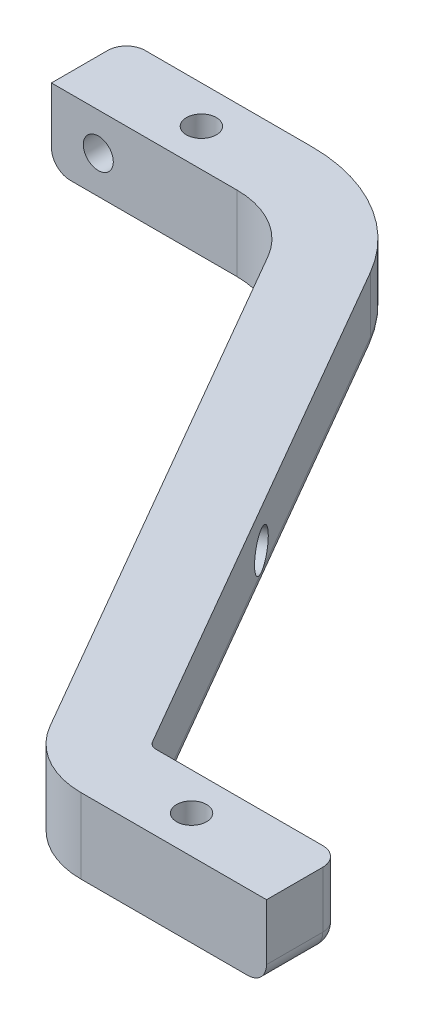
ISO-10303-21;
HEADER;
FILE_DESCRIPTION(('STEP AP214'),'2;1');
FILE_NAME('part.step','',(''),(''),'','','');
FILE_SCHEMA(('AUTOMOTIVE_DESIGN { 1 0 10303 214 1 1 1 1 }'));
ENDSEC;
DATA;
#1=APPLICATION_CONTEXT('core data for automotive mechanical design processes');
#2=APPLICATION_PROTOCOL_DEFINITION('international standard','automotive_design',2000,#1);
#3=PRODUCT_CONTEXT('',#1,'mechanical');
#4=PRODUCT('Part','Part','',(#3));
#5=PRODUCT_RELATED_PRODUCT_CATEGORY('part','',(#4));
#6=PRODUCT_DEFINITION_FORMATION('','',#4);
#7=PRODUCT_DEFINITION_CONTEXT('part definition',#1,'design');
#8=PRODUCT_DEFINITION('design','',#6,#7);
#9=PRODUCT_DEFINITION_SHAPE('','',#8);
#10=(LENGTH_UNIT() NAMED_UNIT(*) SI_UNIT(.MILLI.,.METRE.));
#11=(NAMED_UNIT(*) PLANE_ANGLE_UNIT() SI_UNIT($,.RADIAN.));
#12=(NAMED_UNIT(*) SI_UNIT($,.STERADIAN.) SOLID_ANGLE_UNIT());
#13=UNCERTAINTY_MEASURE_WITH_UNIT(LENGTH_MEASURE(1.E-05),#10,'distance_accuracy_value','');
#14=(GEOMETRIC_REPRESENTATION_CONTEXT(3) GLOBAL_UNCERTAINTY_ASSIGNED_CONTEXT((#13)) GLOBAL_UNIT_ASSIGNED_CONTEXT((#10,
#11,#12)) REPRESENTATION_CONTEXT('',''));
#15=CARTESIAN_POINT('',(0.,0.,0.));
#16=DIRECTION('',(0.,0.,1.));
#17=DIRECTION('',(1.,0.,0.));
#18=AXIS2_PLACEMENT_3D('',#15,#16,#17);
#19=CARTESIAN_POINT('',(93.4021231503077,4.,3.17468245269469));
#20=DIRECTION('',(-0.86602540378444,0.,0.499999999999998));
#21=DIRECTION('',(0.499999999999998,0.,0.86602540378444));
#22=AXIS2_PLACEMENT_3D('',#19,#20,#21);
#23=CYLINDRICAL_SURFACE('',#22,1.6);
#24=CARTESIAN_POINT('',(43.4752086140679,4.,32.));
#25=DIRECTION('',(-0.86602540378444,0.,0.499999999999998));
#26=DIRECTION('',(0.499999999999998,0.,0.86602540378444));
#27=AXIS2_PLACEMENT_3D('',#24,#25,#26);
#28=CIRCLE('',#27,1.6);
#29=CARTESIAN_POINT('',(44.2752086140679,4.,33.3856406460551));
#30=VERTEX_POINT('',#29);
#31=EDGE_CURVE('E220',#30,#30,#28,.T.);
#32=ORIENTED_EDGE('',*,*,#31,.T.);
#33=EDGE_LOOP('',(#32));
#34=FACE_BOUND('',#33,.T.);
#35=CARTESIAN_POINT('',(45.640272123529,4.,30.75));
#36=DIRECTION('',(0.86602540378444,0.,-0.499999999999998));
#37=DIRECTION('',(-0.499999999999998,0.,-0.86602540378444));
#38=AXIS2_PLACEMENT_3D('',#35,#36,#37);
#39=CIRCLE('',#38,1.6);
#40=CARTESIAN_POINT('',(44.840272123529,4.,29.3643593539449));
#41=VERTEX_POINT('',#40);
#42=EDGE_CURVE('E218',#41,#41,#39,.F.);
#43=ORIENTED_EDGE('',*,*,#42,.F.);
#44=EDGE_LOOP('',(#43));
#45=FACE_BOUND('',#44,.T.);
#46=ADVANCED_FACE('F32',(#34,#45),#23,.F.);
#47=CARTESIAN_POINT('',(12.,0.,-4.));
#48=DIRECTION('',(0.,1.,0.));
#49=DIRECTION('',(0.,0.,1.));
#50=AXIS2_PLACEMENT_3D('',#47,#48,#49);
#51=CYLINDRICAL_SURFACE('',#50,1.6);
#52=CARTESIAN_POINT('',(12.,8.,-4.));
#53=DIRECTION('',(0.,1.,0.));
#54=DIRECTION('',(0.,0.,1.));
#55=AXIS2_PLACEMENT_3D('',#52,#53,#54);
#56=CIRCLE('',#55,1.6);
#57=CARTESIAN_POINT('',(12.,8.,-2.4));
#58=VERTEX_POINT('',#57);
#59=EDGE_CURVE('E212',#58,#58,#56,.T.);
#60=ORIENTED_EDGE('',*,*,#59,.T.);
#61=EDGE_LOOP('',(#60));
#62=FACE_BOUND('',#61,.T.);
#63=CARTESIAN_POINT('',(12.,5.5,-4.));
#64=DIRECTION('',(0.,-1.,0.));
#65=DIRECTION('',(0.,0.,-1.));
#66=AXIS2_PLACEMENT_3D('',#63,#64,#65);
#67=CIRCLE('',#66,1.6);
#68=CARTESIAN_POINT('',(12.,5.5,-5.6));
#69=VERTEX_POINT('',#68);
#70=EDGE_CURVE('E208',#69,#69,#67,.F.);
#71=ORIENTED_EDGE('',*,*,#70,.F.);
#72=EDGE_LOOP('',(#71));
#73=FACE_BOUND('',#72,.T.);
#74=ADVANCED_FACE('F431',(#62,#73),#51,.F.);
#75=CARTESIAN_POINT('',(74.9504172281358,0.,60.));
#76=DIRECTION('',(0.,1.,0.));
#77=DIRECTION('',(0.,0.,1.));
#78=AXIS2_PLACEMENT_3D('',#75,#76,#77);
#79=CYLINDRICAL_SURFACE('',#78,1.60000000000001);
#80=CARTESIAN_POINT('',(74.9504172281358,8.,60.));
#81=DIRECTION('',(0.,1.,0.));
#82=DIRECTION('',(0.,0.,1.));
#83=AXIS2_PLACEMENT_3D('',#80,#81,#82);
#84=CIRCLE('',#83,1.60000000000001);
#85=CARTESIAN_POINT('',(74.9504172281358,8.,61.6));
#86=VERTEX_POINT('',#85);
#87=EDGE_CURVE('E323',#86,#86,#84,.T.);
#88=ORIENTED_EDGE('',*,*,#87,.T.);
#89=EDGE_LOOP('',(#88));
#90=FACE_BOUND('',#89,.T.);
#91=CARTESIAN_POINT('',(74.9504172281358,5.5,60.));
#92=DIRECTION('',(0.,-1.,0.));
#93=DIRECTION('',(0.,0.,-1.));
#94=AXIS2_PLACEMENT_3D('',#91,#92,#93);
#95=CIRCLE('',#94,1.60000000000001);
#96=CARTESIAN_POINT('',(74.9504172281358,5.5,58.4));
#97=VERTEX_POINT('',#96);
#98=EDGE_CURVE('E205',#97,#97,#95,.F.);
#99=ORIENTED_EDGE('',*,*,#98,.F.);
#100=EDGE_LOOP('',(#99));
#101=FACE_BOUND('',#100,.T.);
#102=ADVANCED_FACE('F439',(#90,#101),#79,.F.);
#103=CARTESIAN_POINT('',(67.1465696508425,8.,64.));
#104=DIRECTION('',(0.,0.,-1.));
#105=DIRECTION('',(-1.,0.,0.));
#106=AXIS2_PLACEMENT_3D('',#103,#104,#105);
#107=PLANE('',#106);
#108=DIRECTION('',(1.,0.,0.));
#109=VECTOR('',#108,1.);
#110=CARTESIAN_POINT('',(67.1465696508425,0.,64.));
#111=LINE('',#110,#109);
#112=CARTESIAN_POINT('',(67.1465696508425,0.,64.));
#113=VERTEX_POINT('',#112);
#114=CARTESIAN_POINT('',(84.9504172281358,0.,64.));
#115=VERTEX_POINT('',#114);
#116=EDGE_CURVE('E326',#113,#115,#111,.T.);
#117=ORIENTED_EDGE('',*,*,#116,.T.);
#118=CARTESIAN_POINT('',(84.9504172281358,2.,64.));
#119=DIRECTION('',(0.,0.,-1.));
#120=DIRECTION('',(-1.,0.,0.));
#121=AXIS2_PLACEMENT_3D('',#118,#119,#120);
#122=CIRCLE('',#121,2.);
#123=CARTESIAN_POINT('',(86.9504172281358,2.,64.));
#124=VERTEX_POINT('',#123);
#125=EDGE_CURVE('E194',#115,#124,#122,.F.);
#126=ORIENTED_EDGE('',*,*,#125,.T.);
#127=DIRECTION('',(0.,-1.,0.));
#128=VECTOR('',#127,1.);
#129=CARTESIAN_POINT('',(86.9504172281358,8.,64.));
#130=LINE('',#129,#128);
#131=CARTESIAN_POINT('',(86.9504172281358,8.,64.));
#132=VERTEX_POINT('',#131);
#133=EDGE_CURVE('E174',#132,#124,#130,.T.);
#134=ORIENTED_EDGE('',*,*,#133,.F.);
#135=DIRECTION('',(1.,0.,0.));
#136=VECTOR('',#135,1.);
#137=CARTESIAN_POINT('',(67.1465696508425,8.,64.));
#138=LINE('',#137,#136);
#139=CARTESIAN_POINT('',(67.1465696508425,8.,64.));
#140=VERTEX_POINT('',#139);
#141=EDGE_CURVE('E179',#140,#132,#138,.T.);
#142=ORIENTED_EDGE('',*,*,#141,.F.);
#143=DIRECTION('',(0.,-1.,0.));
#144=VECTOR('',#143,1.);
#145=CARTESIAN_POINT('',(67.1465696508425,8.,64.));
#146=LINE('',#145,#144);
#147=EDGE_CURVE('E352',#140,#113,#146,.T.);
#148=ORIENTED_EDGE('',*,*,#147,.T.);
#149=EDGE_LOOP('',(#117,#126,#134,#142,#148));
#150=FACE_BOUND('',#149,.T.);
#151=ADVANCED_FACE('F192',(#150),#107,.F.);
#152=CARTESIAN_POINT('',(86.9504172281358,8.,56.));
#153=DIRECTION('',(1.,0.,0.));
#154=DIRECTION('',(0.,0.,-1.));
#155=AXIS2_PLACEMENT_3D('',#152,#153,#154);
#156=PLANE('',#155);
#157=ORIENTED_EDGE('',*,*,#133,.T.);
#158=DIRECTION('',(0.,0.,1.));
#159=VECTOR('',#158,1.);
#160=CARTESIAN_POINT('',(86.9504172281358,2.,56.));
#161=LINE('',#160,#159);
#162=CARTESIAN_POINT('',(86.9504172281358,2.,58.));
#163=VERTEX_POINT('',#162);
#164=EDGE_CURVE('E55',#124,#163,#161,.F.);
#165=ORIENTED_EDGE('',*,*,#164,.T.);
#166=DIRECTION('',(0.,-1.,0.));
#167=VECTOR('',#166,1.);
#168=CARTESIAN_POINT('',(86.9504172281358,8.,58.));
#169=LINE('',#168,#167);
#170=CARTESIAN_POINT('',(86.9504172281358,8.,58.));
#171=VERTEX_POINT('',#170);
#172=EDGE_CURVE('E175',#163,#171,#169,.F.);
#173=ORIENTED_EDGE('',*,*,#172,.T.);
#174=DIRECTION('',(0.,0.,1.));
#175=VECTOR('',#174,1.);
#176=CARTESIAN_POINT('',(86.9504172281358,8.,56.));
#177=LINE('',#176,#175);
#178=EDGE_CURVE('E170',#171,#132,#177,.T.);
#179=ORIENTED_EDGE('',*,*,#178,.T.);
#180=EDGE_LOOP('',(#157,#165,#173,#179));
#181=FACE_BOUND('',#180,.T.);
#182=ADVANCED_FACE('F172',(#181),#156,.T.);
#183=CARTESIAN_POINT('',(67.1465696508425,8.,56.));
#184=DIRECTION('',(0.,0.,-1.));
#185=DIRECTION('',(-1.,0.,0.));
#186=AXIS2_PLACEMENT_3D('',#183,#184,#185);
#187=PLANE('',#186);
#188=DIRECTION('',(0.,-1.,0.));
#189=VECTOR('',#188,1.);
#190=CARTESIAN_POINT('',(84.9504172281358,8.,56.));
#191=LINE('',#190,#189);
#192=CARTESIAN_POINT('',(84.9504172281358,8.,56.));
#193=VERTEX_POINT('',#192);
#194=CARTESIAN_POINT('',(84.9504172281358,2.,56.));
#195=VERTEX_POINT('',#194);
#196=EDGE_CURVE('E247',#193,#195,#191,.T.);
#197=ORIENTED_EDGE('',*,*,#196,.T.);
#198=DIRECTION('',(1.,0.,0.));
#199=VECTOR('',#198,1.);
#200=CARTESIAN_POINT('',(67.1465696508425,2.,56.));
#201=LINE('',#200,#199);
#202=CARTESIAN_POINT('',(67.1465696508425,2.,56.));
#203=VERTEX_POINT('',#202);
#204=EDGE_CURVE('E249',#195,#203,#201,.F.);
#205=ORIENTED_EDGE('',*,*,#204,.T.);
#206=DIRECTION('',(0.,-1.,0.));
#207=VECTOR('',#206,1.);
#208=CARTESIAN_POINT('',(67.1465696508425,8.,56.));
#209=LINE('',#208,#207);
#210=CARTESIAN_POINT('',(67.1465696508425,8.,56.));
#211=VERTEX_POINT('',#210);
#212=EDGE_CURVE('E196',#211,#203,#209,.T.);
#213=ORIENTED_EDGE('',*,*,#212,.F.);
#214=DIRECTION('',(1.,0.,0.));
#215=VECTOR('',#214,1.);
#216=CARTESIAN_POINT('',(67.1465696508425,8.,56.));
#217=LINE('',#216,#215);
#218=EDGE_CURVE('E178',#211,#193,#217,.T.);
#219=ORIENTED_EDGE('',*,*,#218,.T.);
#220=EDGE_LOOP('',(#197,#205,#213,#219));
#221=FACE_BOUND('',#220,.T.);
#222=ADVANCED_FACE('F540',(#221),#187,.T.);
#223=CARTESIAN_POINT('',(67.1465696508425,8.,55.));
#224=DIRECTION('',(0.,-1.,0.));
#225=DIRECTION('',(0.,0.,-1.));
#226=AXIS2_PLACEMENT_3D('',#223,#224,#225);
#227=CYLINDRICAL_SURFACE('',#226,1.00000000000001);
#228=ORIENTED_EDGE('',*,*,#212,.T.);
#229=CARTESIAN_POINT('',(67.1465696508425,2.,55.));
#230=DIRECTION('',(0.,1.,0.));
#231=DIRECTION('',(0.,0.,1.));
#232=AXIS2_PLACEMENT_3D('',#229,#230,#231);
#233=CIRCLE('',#232,1.00000000000001);
#234=CARTESIAN_POINT('',(66.280544247058,2.,55.5));
#235=VERTEX_POINT('',#234);
#236=EDGE_CURVE('E251',#203,#235,#233,.F.);
#237=ORIENTED_EDGE('',*,*,#236,.T.);
#238=DIRECTION('',(0.,-1.,0.));
#239=VECTOR('',#238,1.);
#240=CARTESIAN_POINT('',(66.280544247058,8.,55.5));
#241=LINE('',#240,#239);
#242=CARTESIAN_POINT('',(66.280544247058,8.,55.5));
#243=VERTEX_POINT('',#242);
#244=EDGE_CURVE('E201',#243,#235,#241,.T.);
#245=ORIENTED_EDGE('',*,*,#244,.F.);
#246=CARTESIAN_POINT('',(67.1465696508425,8.,55.));
#247=DIRECTION('',(0.,1.,0.));
#248=DIRECTION('',(1.,0.,0.));
#249=AXIS2_PLACEMENT_3D('',#246,#247,#248);
#250=CIRCLE('',#249,1.00000000000001);
#251=EDGE_CURVE('E331',#243,#211,#250,.T.);
#252=ORIENTED_EDGE('',*,*,#251,.T.);
#253=EDGE_LOOP('',(#228,#237,#245,#252));
#254=FACE_BOUND('',#253,.T.);
#255=ADVANCED_FACE('F400',(#254),#227,.F.);
#256=CARTESIAN_POINT('',(34.5262794416288,8.,0.500000000000033));
#257=DIRECTION('',(0.86602540378444,0.,-0.499999999999998));
#258=DIRECTION('',(-0.499999999999998,0.,-0.86602540378444));
#259=AXIS2_PLACEMENT_3D('',#256,#257,#258);
#260=PLANE('',#259);
#261=ORIENTED_EDGE('',*,*,#244,.T.);
#262=DIRECTION('',(0.499999999999998,0.,0.86602540378444));
#263=VECTOR('',#262,1.);
#264=CARTESIAN_POINT('',(34.5262794416288,2.,0.50000000000003));
#265=LINE('',#264,#263);
#266=CARTESIAN_POINT('',(50.4034118443435,2.,28.));
#267=VERTEX_POINT('',#266);
#268=EDGE_CURVE('E11',#235,#267,#265,.F.);
#269=ORIENTED_EDGE('',*,*,#268,.T.);
#270=CARTESIAN_POINT('',(50.4034118443435,4.,28.));
#271=DIRECTION('',(0.86602540378444,0.,-0.499999999999998));
#272=DIRECTION('',(-0.499999999999998,0.,-0.86602540378444));
#273=AXIS2_PLACEMENT_3D('',#270,#271,#272);
#274=CIRCLE('',#273,2.);
#275=EDGE_CURVE('E296',#267,#267,#274,.T.);
#276=ORIENTED_EDGE('',*,*,#275,.F.);
#277=DIRECTION('',(0.499999999999998,0.,0.86602540378444));
#278=VECTOR('',#277,1.);
#279=CARTESIAN_POINT('',(34.5262794416288,2.,0.50000000000003));
#280=LINE('',#279,#278);
#281=CARTESIAN_POINT('',(34.5262794416288,2.,0.500000000000035));
#282=VERTEX_POINT('',#281);
#283=EDGE_CURVE('E41',#267,#282,#280,.F.);
#284=ORIENTED_EDGE('',*,*,#283,.T.);
#285=DIRECTION('',(0.,-1.,0.));
#286=VECTOR('',#285,1.);
#287=CARTESIAN_POINT('',(34.5262794416288,8.,0.500000000000035));
#288=LINE('',#287,#286);
#289=CARTESIAN_POINT('',(34.5262794416288,8.,0.500000000000035));
#290=VERTEX_POINT('',#289);
#291=EDGE_CURVE('E377',#290,#282,#288,.T.);
#292=ORIENTED_EDGE('',*,*,#291,.F.);
#293=DIRECTION('',(0.499999999999998,0.,0.86602540378444));
#294=VECTOR('',#293,1.);
#295=CARTESIAN_POINT('',(34.5262794416288,8.,0.500000000000033));
#296=LINE('',#295,#294);
#297=EDGE_CURVE('E334',#290,#243,#296,.T.);
#298=ORIENTED_EDGE('',*,*,#297,.T.);
#299=EDGE_LOOP('',(#261,#269,#276,#284,#292,#298));
#300=FACE_BOUND('',#299,.T.);
#301=ADVANCED_FACE('F380',(#300),#260,.T.);
#302=CARTESIAN_POINT('',(19.8038475772934,8.,9.));
#303=DIRECTION('',(0.,-1.,0.));
#304=DIRECTION('',(0.,0.,-1.));
#305=AXIS2_PLACEMENT_3D('',#302,#303,#304);
#306=CYLINDRICAL_SURFACE('',#305,17.);
#307=ORIENTED_EDGE('',*,*,#291,.T.);
#308=CARTESIAN_POINT('',(19.8038475772934,2.,9.));
#309=DIRECTION('',(0.,1.,0.));
#310=DIRECTION('',(0.,0.,1.));
#311=AXIS2_PLACEMENT_3D('',#308,#309,#310);
#312=CIRCLE('',#311,17.);
#313=CARTESIAN_POINT('',(19.8038475772934,2.,-8.));
#314=VERTEX_POINT('',#313);
#315=EDGE_CURVE('E245',#282,#314,#312,.T.);
#316=ORIENTED_EDGE('',*,*,#315,.T.);
#317=DIRECTION('',(0.,-1.,0.));
#318=VECTOR('',#317,1.);
#319=CARTESIAN_POINT('',(19.8038475772934,8.,-8.));
#320=LINE('',#319,#318);
#321=CARTESIAN_POINT('',(19.8038475772934,8.,-8.));
#322=VERTEX_POINT('',#321);
#323=EDGE_CURVE('E374',#322,#314,#320,.T.);
#324=ORIENTED_EDGE('',*,*,#323,.F.);
#325=CARTESIAN_POINT('',(19.8038475772934,8.,9.));
#326=DIRECTION('',(0.,1.,0.));
#327=DIRECTION('',(1.,0.,0.));
#328=AXIS2_PLACEMENT_3D('',#325,#326,#327);
#329=CIRCLE('',#328,17.);
#330=EDGE_CURVE('E337',#322,#290,#329,.F.);
#331=ORIENTED_EDGE('',*,*,#330,.T.);
#332=EDGE_LOOP('',(#307,#316,#324,#331));
#333=FACE_BOUND('',#332,.T.);
#334=ADVANCED_FACE('F395',(#333),#306,.T.);
#335=CARTESIAN_POINT('',(0.,8.,-8.));
#336=DIRECTION('',(0.,0.,-1.));
#337=DIRECTION('',(-1.,0.,0.));
#338=AXIS2_PLACEMENT_3D('',#335,#336,#337);
#339=PLANE('',#338);
#340=ORIENTED_EDGE('',*,*,#323,.T.);
#341=DIRECTION('',(1.,0.,0.));
#342=VECTOR('',#341,1.);
#343=CARTESIAN_POINT('',(0.,2.,-8.));
#344=LINE('',#343,#342);
#345=CARTESIAN_POINT('',(4.99999999999996,2.,-8.));
#346=VERTEX_POINT('',#345);
#347=EDGE_CURVE('E243',#314,#346,#344,.F.);
#348=ORIENTED_EDGE('',*,*,#347,.T.);
#349=CARTESIAN_POINT('',(4.99999999999996,4.,-8.));
#350=DIRECTION('',(0.,0.,1.));
#351=DIRECTION('',(1.,0.,0.));
#352=AXIS2_PLACEMENT_3D('',#349,#350,#351);
#353=CIRCLE('',#352,2.);
#354=EDGE_CURVE('E305',#346,#346,#353,.T.);
#355=ORIENTED_EDGE('',*,*,#354,.T.);
#356=DIRECTION('',(1.,0.,0.));
#357=VECTOR('',#356,1.);
#358=CARTESIAN_POINT('',(0.,2.,-8.));
#359=LINE('',#358,#357);
#360=CARTESIAN_POINT('',(2.,2.,-8.));
#361=VERTEX_POINT('',#360);
#362=EDGE_CURVE('E241',#346,#361,#359,.F.);
#363=ORIENTED_EDGE('',*,*,#362,.T.);
#364=DIRECTION('',(0.,-1.,0.));
#365=VECTOR('',#364,1.);
#366=CARTESIAN_POINT('',(2.,8.,-8.));
#367=LINE('',#366,#365);
#368=CARTESIAN_POINT('',(2.,8.,-8.));
#369=VERTEX_POINT('',#368);
#370=EDGE_CURVE('E239',#361,#369,#367,.F.);
#371=ORIENTED_EDGE('',*,*,#370,.T.);
#372=DIRECTION('',(1.,0.,0.));
#373=VECTOR('',#372,1.);
#374=CARTESIAN_POINT('',(0.,8.,-8.));
#375=LINE('',#374,#373);
#376=EDGE_CURVE('E340',#369,#322,#375,.T.);
#377=ORIENTED_EDGE('',*,*,#376,.T.);
#378=EDGE_LOOP('',(#340,#348,#355,#363,#371,#377));
#379=FACE_BOUND('',#378,.T.);
#380=ADVANCED_FACE('F577',(#379),#339,.T.);
#381=CARTESIAN_POINT('',(0.,8.,0.));
#382=DIRECTION('',(-1.,0.,0.));
#383=DIRECTION('',(0.,0.,1.));
#384=AXIS2_PLACEMENT_3D('',#381,#382,#383);
#385=PLANE('',#384);
#386=DIRECTION('',(0.,-1.,0.));
#387=VECTOR('',#386,1.);
#388=CARTESIAN_POINT('',(0.,8.,-6.));
#389=LINE('',#388,#387);
#390=CARTESIAN_POINT('',(0.,8.,-6.));
#391=VERTEX_POINT('',#390);
#392=CARTESIAN_POINT('',(0.,2.,-6.));
#393=VERTEX_POINT('',#392);
#394=EDGE_CURVE('E253',#391,#393,#389,.T.);
#395=ORIENTED_EDGE('',*,*,#394,.T.);
#396=DIRECTION('',(0.,0.,-1.));
#397=VECTOR('',#396,1.);
#398=CARTESIAN_POINT('',(0.,2.,0.));
#399=LINE('',#398,#397);
#400=CARTESIAN_POINT('',(0.,2.,0.));
#401=VERTEX_POINT('',#400);
#402=EDGE_CURVE('E255',#393,#401,#399,.F.);
#403=ORIENTED_EDGE('',*,*,#402,.T.);
#404=DIRECTION('',(0.,-1.,0.));
#405=VECTOR('',#404,1.);
#406=CARTESIAN_POINT('',(0.,8.,0.));
#407=LINE('',#406,#405);
#408=CARTESIAN_POINT('',(0.,8.,0.));
#409=VERTEX_POINT('',#408);
#410=EDGE_CURVE('E371',#409,#401,#407,.T.);
#411=ORIENTED_EDGE('',*,*,#410,.F.);
#412=DIRECTION('',(0.,0.,-1.));
#413=VECTOR('',#412,1.);
#414=CARTESIAN_POINT('',(0.,8.,0.));
#415=LINE('',#414,#413);
#416=EDGE_CURVE('E342',#409,#391,#415,.T.);
#417=ORIENTED_EDGE('',*,*,#416,.T.);
#418=EDGE_LOOP('',(#395,#403,#411,#417));
#419=FACE_BOUND('',#418,.T.);
#420=ADVANCED_FACE('F472',(#419),#385,.T.);
#421=CARTESIAN_POINT('',(0.,8.,0.));
#422=DIRECTION('',(0.,0.,-1.));
#423=DIRECTION('',(-1.,0.,0.));
#424=AXIS2_PLACEMENT_3D('',#421,#422,#423);
#425=PLANE('',#424);
#426=CARTESIAN_POINT('',(5.,4.,0.));
#427=DIRECTION('',(0.,0.,-1.));
#428=DIRECTION('',(-1.,0.,0.));
#429=AXIS2_PLACEMENT_3D('',#426,#427,#428);
#430=CIRCLE('',#429,1.60000000000001);
#431=CARTESIAN_POINT('',(3.4,4.,0.));
#432=VERTEX_POINT('',#431);
#433=EDGE_CURVE('E216',#432,#432,#430,.T.);
#434=ORIENTED_EDGE('',*,*,#433,.T.);
#435=EDGE_LOOP('',(#434));
#436=FACE_BOUND('',#435,.T.);
#437=ORIENTED_EDGE('',*,*,#410,.T.);
#438=CARTESIAN_POINT('',(2.,2.,0.));
#439=DIRECTION('',(0.,0.,-1.));
#440=DIRECTION('',(-1.,0.,0.));
#441=AXIS2_PLACEMENT_3D('',#438,#439,#440);
#442=CIRCLE('',#441,2.);
#443=CARTESIAN_POINT('',(2.,0.,0.));
#444=VERTEX_POINT('',#443);
#445=EDGE_CURVE('E257',#401,#444,#442,.F.);
#446=ORIENTED_EDGE('',*,*,#445,.T.);
#447=DIRECTION('',(1.,0.,0.));
#448=VECTOR('',#447,1.);
#449=CARTESIAN_POINT('',(0.,0.,0.));
#450=LINE('',#449,#448);
#451=CARTESIAN_POINT('',(19.8038475772934,0.,0.));
#452=VERTEX_POINT('',#451);
#453=EDGE_CURVE('E354',#444,#452,#450,.T.);
#454=ORIENTED_EDGE('',*,*,#453,.T.);
#455=DIRECTION('',(0.,-1.,0.));
#456=VECTOR('',#455,1.);
#457=CARTESIAN_POINT('',(19.8038475772934,8.,0.));
#458=LINE('',#457,#456);
#459=CARTESIAN_POINT('',(19.8038475772934,8.,0.));
#460=VERTEX_POINT('',#459);
#461=EDGE_CURVE('E368',#460,#452,#458,.T.);
#462=ORIENTED_EDGE('',*,*,#461,.F.);
#463=DIRECTION('',(1.,0.,0.));
#464=VECTOR('',#463,1.);
#465=CARTESIAN_POINT('',(0.,8.,0.));
#466=LINE('',#465,#464);
#467=EDGE_CURVE('E345',#409,#460,#466,.T.);
#468=ORIENTED_EDGE('',*,*,#467,.F.);
#469=EDGE_LOOP('',(#437,#446,#454,#462,#468));
#470=FACE_BOUND('',#469,.T.);
#471=ADVANCED_FACE('F468',(#436,#470),#425,.F.);
#472=CARTESIAN_POINT('',(19.8038475772934,8.,9.));
#473=DIRECTION('',(0.,-1.,0.));
#474=DIRECTION('',(0.,0.,-1.));
#475=AXIS2_PLACEMENT_3D('',#472,#473,#474);
#476=CYLINDRICAL_SURFACE('',#475,9.);
#477=CARTESIAN_POINT('',(19.8038475772934,0.,9.));
#478=DIRECTION('',(0.,-1.,0.));
#479=DIRECTION('',(0.,0.,-1.));
#480=AXIS2_PLACEMENT_3D('',#477,#478,#479);
#481=CIRCLE('',#480,9.);
#482=CARTESIAN_POINT('',(27.5980762113533,0.,4.50000000000002));
#483=VERTEX_POINT('',#482);
#484=EDGE_CURVE('E356',#452,#483,#481,.T.);
#485=ORIENTED_EDGE('',*,*,#484,.T.);
#486=DIRECTION('',(0.,-1.,0.));
#487=VECTOR('',#486,1.);
#488=CARTESIAN_POINT('',(27.5980762113533,8.,4.50000000000002));
#489=LINE('',#488,#487);
#490=CARTESIAN_POINT('',(27.5980762113533,8.,4.50000000000002));
#491=VERTEX_POINT('',#490);
#492=EDGE_CURVE('E365',#491,#483,#489,.T.);
#493=ORIENTED_EDGE('',*,*,#492,.F.);
#494=CARTESIAN_POINT('',(19.8038475772934,8.,9.));
#495=DIRECTION('',(0.,-1.,0.));
#496=DIRECTION('',(0.,0.,-1.));
#497=AXIS2_PLACEMENT_3D('',#494,#495,#496);
#498=CIRCLE('',#497,9.);
#499=EDGE_CURVE('E347',#460,#491,#498,.T.);
#500=ORIENTED_EDGE('',*,*,#499,.F.);
#501=ORIENTED_EDGE('',*,*,#461,.T.);
#502=EDGE_LOOP('',(#485,#493,#500,#501));
#503=FACE_BOUND('',#502,.T.);
#504=ADVANCED_FACE('F471',(#503),#476,.F.);
#505=CARTESIAN_POINT('',(27.5980762113533,8.,4.50000000000002));
#506=DIRECTION('',(0.86602540378444,0.,-0.499999999999998));
#507=DIRECTION('',(-0.499999999999998,0.,-0.86602540378444));
#508=AXIS2_PLACEMENT_3D('',#505,#506,#507);
#509=PLANE('',#508);
#510=ORIENTED_EDGE('',*,*,#31,.F.);
#511=EDGE_LOOP('',(#510));
#512=FACE_BOUND('',#511,.T.);
#513=DIRECTION('',(0.499999999999998,0.,0.86602540378444));
#514=VECTOR('',#513,1.);
#515=CARTESIAN_POINT('',(27.5980762113533,0.,4.50000000000002));
#516=LINE('',#515,#514);
#517=CARTESIAN_POINT('',(59.3523410167825,0.,59.5));
#518=VERTEX_POINT('',#517);
#519=EDGE_CURVE('E358',#483,#518,#516,.T.);
#520=ORIENTED_EDGE('',*,*,#519,.T.);
#521=DIRECTION('',(0.,-1.,0.));
#522=VECTOR('',#521,1.);
#523=CARTESIAN_POINT('',(59.3523410167825,8.,59.5));
#524=LINE('',#523,#522);
#525=CARTESIAN_POINT('',(59.3523410167825,8.,59.5));
#526=VERTEX_POINT('',#525);
#527=EDGE_CURVE('E362',#526,#518,#524,.T.);
#528=ORIENTED_EDGE('',*,*,#527,.F.);
#529=DIRECTION('',(0.499999999999998,0.,0.86602540378444));
#530=VECTOR('',#529,1.);
#531=CARTESIAN_POINT('',(27.5980762113533,8.,4.50000000000002));
#532=LINE('',#531,#530);
#533=EDGE_CURVE('E349',#491,#526,#532,.T.);
#534=ORIENTED_EDGE('',*,*,#533,.F.);
#535=ORIENTED_EDGE('',*,*,#492,.T.);
#536=EDGE_LOOP('',(#520,#528,#534,#535));
#537=FACE_BOUND('',#536,.T.);
#538=ADVANCED_FACE('F568',(#512,#537),#509,.F.);
#539=CARTESIAN_POINT('',(67.1465696508425,8.,55.));
#540=DIRECTION('',(0.,-1.,0.));
#541=DIRECTION('',(0.,0.,-1.));
#542=AXIS2_PLACEMENT_3D('',#539,#540,#541);
#543=CYLINDRICAL_SURFACE('',#542,9.00000000000001);
#544=CARTESIAN_POINT('',(67.1465696508425,0.,55.));
#545=DIRECTION('',(0.,1.,0.));
#546=DIRECTION('',(0.,0.,1.));
#547=AXIS2_PLACEMENT_3D('',#544,#545,#546);
#548=CIRCLE('',#547,9.00000000000001);
#549=EDGE_CURVE('E189',#518,#113,#548,.T.);
#550=ORIENTED_EDGE('',*,*,#549,.T.);
#551=ORIENTED_EDGE('',*,*,#147,.F.);
#552=CARTESIAN_POINT('',(67.1465696508425,8.,55.));
#553=DIRECTION('',(0.,1.,0.));
#554=DIRECTION('',(0.,0.,1.));
#555=AXIS2_PLACEMENT_3D('',#552,#553,#554);
#556=CIRCLE('',#555,9.00000000000001);
#557=EDGE_CURVE('E185',#526,#140,#556,.T.);
#558=ORIENTED_EDGE('',*,*,#557,.F.);
#559=ORIENTED_EDGE('',*,*,#527,.T.);
#560=EDGE_LOOP('',(#550,#551,#558,#559));
#561=FACE_BOUND('',#560,.T.);
#562=ADVANCED_FACE('F563',(#561),#543,.T.);
#563=CARTESIAN_POINT('',(67.1465696508425,8.,55.));
#564=DIRECTION('',(0.,1.,0.));
#565=DIRECTION('',(1.,0.,0.));
#566=AXIS2_PLACEMENT_3D('',#563,#564,#565);
#567=PLANE('',#566);
#568=ORIENTED_EDGE('',*,*,#87,.F.);
#569=EDGE_LOOP('',(#568));
#570=FACE_BOUND('',#569,.T.);
#571=ORIENTED_EDGE('',*,*,#59,.F.);
#572=EDGE_LOOP('',(#571));
#573=FACE_BOUND('',#572,.T.);
#574=ORIENTED_EDGE('',*,*,#376,.F.);
#575=CARTESIAN_POINT('',(2.,8.,-6.));
#576=DIRECTION('',(0.,1.,0.));
#577=DIRECTION('',(0.,0.,1.));
#578=AXIS2_PLACEMENT_3D('',#575,#576,#577);
#579=CIRCLE('',#578,2.);
#580=EDGE_CURVE('E261',#369,#391,#579,.T.);
#581=ORIENTED_EDGE('',*,*,#580,.T.);
#582=ORIENTED_EDGE('',*,*,#416,.F.);
#583=ORIENTED_EDGE('',*,*,#467,.T.);
#584=ORIENTED_EDGE('',*,*,#499,.T.);
#585=ORIENTED_EDGE('',*,*,#533,.T.);
#586=ORIENTED_EDGE('',*,*,#557,.T.);
#587=ORIENTED_EDGE('',*,*,#141,.T.);
#588=ORIENTED_EDGE('',*,*,#178,.F.);
#589=CARTESIAN_POINT('',(84.9504172281358,8.,58.));
#590=DIRECTION('',(0.,1.,0.));
#591=DIRECTION('',(0.,0.,1.));
#592=AXIS2_PLACEMENT_3D('',#589,#590,#591);
#593=CIRCLE('',#592,2.);
#594=EDGE_CURVE('E259',#171,#193,#593,.T.);
#595=ORIENTED_EDGE('',*,*,#594,.T.);
#596=ORIENTED_EDGE('',*,*,#218,.F.);
#597=ORIENTED_EDGE('',*,*,#251,.F.);
#598=ORIENTED_EDGE('',*,*,#297,.F.);
#599=ORIENTED_EDGE('',*,*,#330,.F.);
#600=EDGE_LOOP('',(#574,#581,#582,#583,#584,#585,#586,#587,#588,#595,#596,#597,#598,#599));
#601=FACE_BOUND('',#600,.T.);
#602=ADVANCED_FACE('F183',(#570,#573,#601),#567,.T.);
#603=CARTESIAN_POINT('',(67.1465696508425,0.,55.));
#604=DIRECTION('',(0.,1.,0.));
#605=DIRECTION('',(1.,0.,0.));
#606=AXIS2_PLACEMENT_3D('',#603,#604,#605);
#607=PLANE('',#606);
#608=DIRECTION('',(1.,0.,0.));
#609=VECTOR('',#608,1.);
#610=CARTESIAN_POINT('',(86.9504172281358,0.,58.));
#611=LINE('',#610,#609);
#612=CARTESIAN_POINT('',(74.9504172281358,0.,58.));
#613=VERTEX_POINT('',#612);
#614=CARTESIAN_POINT('',(84.9504172281358,0.,58.));
#615=VERTEX_POINT('',#614);
#616=EDGE_CURVE('E235',#613,#615,#611,.T.);
#617=ORIENTED_EDGE('',*,*,#616,.T.);
#618=DIRECTION('',(0.,0.,1.));
#619=VECTOR('',#618,1.);
#620=CARTESIAN_POINT('',(84.9504172281358,0.,64.));
#621=LINE('',#620,#619);
#622=EDGE_CURVE('E237',#615,#115,#621,.T.);
#623=ORIENTED_EDGE('',*,*,#622,.T.);
#624=ORIENTED_EDGE('',*,*,#116,.F.);
#625=ORIENTED_EDGE('',*,*,#549,.F.);
#626=ORIENTED_EDGE('',*,*,#519,.F.);
#627=ORIENTED_EDGE('',*,*,#484,.F.);
#628=ORIENTED_EDGE('',*,*,#453,.F.);
#629=DIRECTION('',(0.,0.,-1.));
#630=VECTOR('',#629,1.);
#631=CARTESIAN_POINT('',(2.,0.,-8.));
#632=LINE('',#631,#630);
#633=CARTESIAN_POINT('',(2.,0.,-6.));
#634=VERTEX_POINT('',#633);
#635=EDGE_CURVE('E233',#444,#634,#632,.T.);
#636=ORIENTED_EDGE('',*,*,#635,.T.);
#637=DIRECTION('',(1.,0.,0.));
#638=VECTOR('',#637,1.);
#639=CARTESIAN_POINT('',(19.8038475772934,0.,-6.));
#640=LINE('',#639,#638);
#641=CARTESIAN_POINT('',(12.,0.,-6.));
#642=VERTEX_POINT('',#641);
#643=EDGE_CURVE('E230',#634,#642,#640,.T.);
#644=ORIENTED_EDGE('',*,*,#643,.T.);
#645=CARTESIAN_POINT('',(12.,0.,-4.));
#646=DIRECTION('',(0.,-1.,0.));
#647=DIRECTION('',(0.,0.,-1.));
#648=AXIS2_PLACEMENT_3D('',#645,#646,#647);
#649=CIRCLE('',#648,2.);
#650=EDGE_CURVE('E312',#642,#642,#649,.T.);
#651=ORIENTED_EDGE('',*,*,#650,.F.);
#652=DIRECTION('',(1.,0.,0.));
#653=VECTOR('',#652,1.);
#654=CARTESIAN_POINT('',(19.8038475772934,0.,-6.));
#655=LINE('',#654,#653);
#656=CARTESIAN_POINT('',(19.8038475772934,0.,-6.));
#657=VERTEX_POINT('',#656);
#658=EDGE_CURVE('E228',#642,#657,#655,.T.);
#659=ORIENTED_EDGE('',*,*,#658,.T.);
#660=CARTESIAN_POINT('',(19.8038475772934,0.,9.));
#661=DIRECTION('',(0.,1.,0.));
#662=DIRECTION('',(0.,0.,1.));
#663=AXIS2_PLACEMENT_3D('',#660,#661,#662);
#664=CIRCLE('',#663,15.);
#665=CARTESIAN_POINT('',(32.79422863406,0.,1.50000000000003));
#666=VERTEX_POINT('',#665);
#667=EDGE_CURVE('E226',#657,#666,#664,.F.);
#668=ORIENTED_EDGE('',*,*,#667,.T.);
#669=DIRECTION('',(0.499999999999998,0.,0.86602540378444));
#670=VECTOR('',#669,1.);
#671=CARTESIAN_POINT('',(64.5484934394892,0.,56.5));
#672=LINE('',#671,#670);
#673=CARTESIAN_POINT('',(64.5484934394892,0.,56.5));
#674=VERTEX_POINT('',#673);
#675=EDGE_CURVE('E195',#666,#674,#672,.T.);
#676=ORIENTED_EDGE('',*,*,#675,.T.);
#677=CARTESIAN_POINT('',(67.1465696508425,0.,55.));
#678=DIRECTION('',(0.,1.,0.));
#679=DIRECTION('',(0.,0.,1.));
#680=AXIS2_PLACEMENT_3D('',#677,#678,#679);
#681=CIRCLE('',#680,3.00000000000001);
#682=CARTESIAN_POINT('',(67.1465696508425,0.,58.));
#683=VERTEX_POINT('',#682);
#684=EDGE_CURVE('E198',#674,#683,#681,.T.);
#685=ORIENTED_EDGE('',*,*,#684,.T.);
#686=DIRECTION('',(1.,0.,0.));
#687=VECTOR('',#686,1.);
#688=CARTESIAN_POINT('',(86.9504172281358,0.,58.));
#689=LINE('',#688,#687);
#690=EDGE_CURVE('E224',#683,#613,#689,.T.);
#691=ORIENTED_EDGE('',*,*,#690,.T.);
#692=CARTESIAN_POINT('',(74.9504172281358,0.,60.));
#693=DIRECTION('',(0.,-1.,0.));
#694=DIRECTION('',(0.,0.,-1.));
#695=AXIS2_PLACEMENT_3D('',#692,#693,#694);
#696=CIRCLE('',#695,2.);
#697=EDGE_CURVE('E315',#613,#613,#696,.T.);
#698=ORIENTED_EDGE('',*,*,#697,.F.);
#699=EDGE_LOOP('',(#617,#623,#624,#625,#626,#627,#628,#636,#644,#651,#659,#668,#676,#685,#691,#698));
#700=FACE_BOUND('',#699,.T.);
#701=ADVANCED_FACE('F410',(#700),#607,.F.);
#702=CARTESIAN_POINT('',(74.9504172281358,5.5,60.));
#703=DIRECTION('',(0.,-1.,0.));
#704=DIRECTION('',(0.,0.,-1.));
#705=AXIS2_PLACEMENT_3D('',#702,#703,#704);
#706=PLANE('',#705);
#707=CARTESIAN_POINT('',(74.9504172281358,5.5,60.));
#708=DIRECTION('',(0.,-1.,0.));
#709=DIRECTION('',(0.,0.,-1.));
#710=AXIS2_PLACEMENT_3D('',#707,#708,#709);
#711=CIRCLE('',#710,2.);
#712=CARTESIAN_POINT('',(74.9504172281358,5.5,58.));
#713=VERTEX_POINT('',#712);
#714=EDGE_CURVE('E209',#713,#713,#711,.T.);
#715=ORIENTED_EDGE('',*,*,#714,.T.);
#716=EDGE_LOOP('',(#715));
#717=FACE_BOUND('',#716,.T.);
#718=ORIENTED_EDGE('',*,*,#98,.T.);
#719=EDGE_LOOP('',(#718));
#720=FACE_BOUND('',#719,.T.);
#721=ADVANCED_FACE('F415',(#717,#720),#706,.T.);
#722=CARTESIAN_POINT('',(74.9504172281358,5.5,60.));
#723=DIRECTION('',(0.,-1.,0.));
#724=DIRECTION('',(0.,0.,-1.));
#725=AXIS2_PLACEMENT_3D('',#722,#723,#724);
#726=CYLINDRICAL_SURFACE('',#725,2.);
#727=ORIENTED_EDGE('',*,*,#714,.F.);
#728=EDGE_LOOP('',(#727));
#729=FACE_BOUND('',#728,.T.);
#730=ORIENTED_EDGE('',*,*,#697,.T.);
#731=EDGE_LOOP('',(#730));
#732=FACE_BOUND('',#731,.T.);
#733=ADVANCED_FACE('F412',(#729,#732),#726,.F.);
#734=CARTESIAN_POINT('',(12.,5.5,-4.));
#735=DIRECTION('',(0.,-1.,0.));
#736=DIRECTION('',(0.,0.,-1.));
#737=AXIS2_PLACEMENT_3D('',#734,#735,#736);
#738=PLANE('',#737);
#739=CARTESIAN_POINT('',(12.,5.5,-4.));
#740=DIRECTION('',(0.,-1.,0.));
#741=DIRECTION('',(0.,0.,-1.));
#742=AXIS2_PLACEMENT_3D('',#739,#740,#741);
#743=CIRCLE('',#742,2.);
#744=CARTESIAN_POINT('',(12.,5.5,-6.));
#745=VERTEX_POINT('',#744);
#746=EDGE_CURVE('E318',#745,#745,#743,.T.);
#747=ORIENTED_EDGE('',*,*,#746,.T.);
#748=EDGE_LOOP('',(#747));
#749=FACE_BOUND('',#748,.T.);
#750=ORIENTED_EDGE('',*,*,#70,.T.);
#751=EDGE_LOOP('',(#750));
#752=FACE_BOUND('',#751,.T.);
#753=ADVANCED_FACE('F414',(#749,#752),#738,.T.);
#754=CARTESIAN_POINT('',(12.,5.5,-4.));
#755=DIRECTION('',(0.,-1.,0.));
#756=DIRECTION('',(0.,0.,-1.));
#757=AXIS2_PLACEMENT_3D('',#754,#755,#756);
#758=CYLINDRICAL_SURFACE('',#757,2.);
#759=ORIENTED_EDGE('',*,*,#746,.F.);
#760=EDGE_LOOP('',(#759));
#761=FACE_BOUND('',#760,.T.);
#762=ORIENTED_EDGE('',*,*,#650,.T.);
#763=EDGE_LOOP('',(#762));
#764=FACE_BOUND('',#763,.T.);
#765=ADVANCED_FACE('F423',(#761,#764),#758,.F.);
#766=CARTESIAN_POINT('',(5.,4.,-8.));
#767=DIRECTION('',(0.,0.,1.));
#768=DIRECTION('',(1.,0.,0.));
#769=AXIS2_PLACEMENT_3D('',#766,#767,#768);
#770=CYLINDRICAL_SURFACE('',#769,1.60000000000001);
#771=CARTESIAN_POINT('',(5.,4.,-2.5));
#772=DIRECTION('',(0.,0.,1.));
#773=DIRECTION('',(1.,0.,0.));
#774=AXIS2_PLACEMENT_3D('',#771,#772,#773);
#775=CIRCLE('',#774,1.60000000000001);
#776=CARTESIAN_POINT('',(6.60000000000001,4.,-2.5));
#777=VERTEX_POINT('',#776);
#778=EDGE_CURVE('E213',#777,#777,#775,.T.);
#779=ORIENTED_EDGE('',*,*,#778,.F.);
#780=EDGE_LOOP('',(#779));
#781=FACE_BOUND('',#780,.T.);
#782=ORIENTED_EDGE('',*,*,#433,.F.);
#783=EDGE_LOOP('',(#782));
#784=FACE_BOUND('',#783,.T.);
#785=ADVANCED_FACE('F454',(#781,#784),#770,.F.);
#786=CARTESIAN_POINT('',(4.99999999999996,4.,-2.5));
#787=DIRECTION('',(0.,0.,-1.));
#788=DIRECTION('',(-1.,0.,0.));
#789=AXIS2_PLACEMENT_3D('',#786,#787,#788);
#790=CYLINDRICAL_SURFACE('',#789,2.);
#791=CARTESIAN_POINT('',(4.99999999999996,4.,-2.5));
#792=DIRECTION('',(0.,0.,1.));
#793=DIRECTION('',(1.,0.,0.));
#794=AXIS2_PLACEMENT_3D('',#791,#792,#793);
#795=CIRCLE('',#794,2.);
#796=CARTESIAN_POINT('',(6.99999999999996,4.,-2.5));
#797=VERTEX_POINT('',#796);
#798=EDGE_CURVE('E217',#797,#797,#795,.T.);
#799=ORIENTED_EDGE('',*,*,#798,.T.);
#800=EDGE_LOOP('',(#799));
#801=FACE_BOUND('',#800,.T.);
#802=ORIENTED_EDGE('',*,*,#354,.F.);
#803=EDGE_LOOP('',(#802));
#804=FACE_BOUND('',#803,.T.);
#805=ADVANCED_FACE('F450',(#801,#804),#790,.F.);
#806=CARTESIAN_POINT('',(4.99999999999996,4.,-2.5));
#807=DIRECTION('',(0.,0.,1.));
#808=DIRECTION('',(1.,0.,0.));
#809=AXIS2_PLACEMENT_3D('',#806,#807,#808);
#810=PLANE('',#809);
#811=ORIENTED_EDGE('',*,*,#778,.T.);
#812=EDGE_LOOP('',(#811));
#813=FACE_BOUND('',#812,.T.);
#814=ORIENTED_EDGE('',*,*,#798,.F.);
#815=EDGE_LOOP('',(#814));
#816=FACE_BOUND('',#815,.T.);
#817=ADVANCED_FACE('F447',(#813,#816),#810,.F.);
#818=CARTESIAN_POINT('',(45.640272123529,4.,30.75));
#819=DIRECTION('',(0.86602540378444,0.,-0.499999999999998));
#820=DIRECTION('',(-0.499999999999998,0.,-0.86602540378444));
#821=AXIS2_PLACEMENT_3D('',#818,#819,#820);
#822=PLANE('',#821);
#823=CARTESIAN_POINT('',(45.640272123529,4.,30.75));
#824=DIRECTION('',(0.86602540378444,0.,-0.499999999999998));
#825=DIRECTION('',(-0.499999999999998,0.,-0.86602540378444));
#826=AXIS2_PLACEMENT_3D('',#823,#824,#825);
#827=CIRCLE('',#826,2.);
#828=CARTESIAN_POINT('',(44.640272123529,4.,29.0179491924311));
#829=VERTEX_POINT('',#828);
#830=EDGE_CURVE('E221',#829,#829,#827,.T.);
#831=ORIENTED_EDGE('',*,*,#830,.T.);
#832=EDGE_LOOP('',(#831));
#833=FACE_BOUND('',#832,.T.);
#834=ORIENTED_EDGE('',*,*,#42,.T.);
#835=EDGE_LOOP('',(#834));
#836=FACE_BOUND('',#835,.T.);
#837=ADVANCED_FACE('F449',(#833,#836),#822,.T.);
#838=CARTESIAN_POINT('',(45.640272123529,4.,30.75));
#839=DIRECTION('',(0.86602540378444,0.,-0.499999999999998));
#840=DIRECTION('',(-0.499999999999998,0.,-0.86602540378444));
#841=AXIS2_PLACEMENT_3D('',#838,#839,#840);
#842=CYLINDRICAL_SURFACE('',#841,2.);
#843=ORIENTED_EDGE('',*,*,#830,.F.);
#844=EDGE_LOOP('',(#843));
#845=FACE_BOUND('',#844,.T.);
#846=ORIENTED_EDGE('',*,*,#275,.T.);
#847=EDGE_LOOP('',(#846));
#848=FACE_BOUND('',#847,.T.);
#849=ADVANCED_FACE('F445',(#845,#848),#842,.F.);
#850=CARTESIAN_POINT('',(84.9504172281358,2.,55.));
#851=DIRECTION('',(0.,0.,-1.));
#852=DIRECTION('',(-1.,0.,0.));
#853=AXIS2_PLACEMENT_3D('',#850,#851,#852);
#854=CYLINDRICAL_SURFACE('',#853,2.);
#855=ORIENTED_EDGE('',*,*,#125,.F.);
#856=ORIENTED_EDGE('',*,*,#622,.F.);
#857=CARTESIAN_POINT('',(84.9504172281358,2.,58.));
#858=DIRECTION('',(0.,0.,-1.));
#859=DIRECTION('',(-1.,0.,0.));
#860=AXIS2_PLACEMENT_3D('',#857,#858,#859);
#861=CIRCLE('',#860,2.);
#862=EDGE_CURVE('E36',#163,#615,#861,.T.);
#863=ORIENTED_EDGE('',*,*,#862,.F.);
#864=ORIENTED_EDGE('',*,*,#164,.F.);
#865=EDGE_LOOP('',(#855,#856,#863,#864));
#866=FACE_BOUND('',#865,.T.);
#867=ADVANCED_FACE('F34',(#866),#854,.T.);
#868=CARTESIAN_POINT('',(84.9504172281358,8.,58.));
#869=DIRECTION('',(0.,-1.,0.));
#870=DIRECTION('',(0.,0.,-1.));
#871=AXIS2_PLACEMENT_3D('',#868,#869,#870);
#872=CYLINDRICAL_SURFACE('',#871,2.);
#873=ORIENTED_EDGE('',*,*,#594,.F.);
#874=ORIENTED_EDGE('',*,*,#172,.F.);
#875=CARTESIAN_POINT('',(84.9504172281358,2.,58.));
#876=DIRECTION('',(0.,-1.,0.));
#877=DIRECTION('',(0.,0.,-1.));
#878=AXIS2_PLACEMENT_3D('',#875,#876,#877);
#879=CIRCLE('',#878,2.);
#880=EDGE_CURVE('E290',#195,#163,#879,.T.);
#881=ORIENTED_EDGE('',*,*,#880,.F.);
#882=ORIENTED_EDGE('',*,*,#196,.F.);
#883=EDGE_LOOP('',(#873,#874,#881,#882));
#884=FACE_BOUND('',#883,.T.);
#885=ADVANCED_FACE('F532',(#884),#872,.T.);
#886=CARTESIAN_POINT('',(84.9504172281358,2.,58.));
#887=DIRECTION('',(0.,0.,1.));
#888=DIRECTION('',(1.,0.,0.));
#889=AXIS2_PLACEMENT_3D('',#886,#887,#888);
#890=SPHERICAL_SURFACE('',#889,2.);
#891=ORIENTED_EDGE('',*,*,#880,.T.);
#892=ORIENTED_EDGE('',*,*,#862,.T.);
#893=CARTESIAN_POINT('',(84.9504172281358,2.,58.));
#894=DIRECTION('',(1.,0.,0.));
#895=DIRECTION('',(0.,0.,-1.));
#896=AXIS2_PLACEMENT_3D('',#893,#894,#895);
#897=CIRCLE('',#896,2.);
#898=EDGE_CURVE('E288',#195,#615,#897,.F.);
#899=ORIENTED_EDGE('',*,*,#898,.F.);
#900=EDGE_LOOP('',(#891,#892,#899));
#901=FACE_BOUND('',#900,.T.);
#902=ADVANCED_FACE('F530',(#901),#890,.T.);
#903=CARTESIAN_POINT('',(67.1465696508425,2.,58.));
#904=DIRECTION('',(-1.,0.,0.));
#905=DIRECTION('',(0.,0.,1.));
#906=AXIS2_PLACEMENT_3D('',#903,#904,#905);
#907=CYLINDRICAL_SURFACE('',#906,2.);
#908=ORIENTED_EDGE('',*,*,#616,.F.);
#909=ORIENTED_EDGE('',*,*,#690,.F.);
#910=CARTESIAN_POINT('',(67.1465696508425,2.,58.));
#911=DIRECTION('',(-1.,0.,0.));
#912=DIRECTION('',(0.,0.,1.));
#913=AXIS2_PLACEMENT_3D('',#910,#911,#912);
#914=CIRCLE('',#913,2.);
#915=EDGE_CURVE('E285',#203,#683,#914,.T.);
#916=ORIENTED_EDGE('',*,*,#915,.F.);
#917=ORIENTED_EDGE('',*,*,#204,.F.);
#918=ORIENTED_EDGE('',*,*,#898,.T.);
#919=EDGE_LOOP('',(#908,#909,#916,#917,#918));
#920=FACE_BOUND('',#919,.T.);
#921=ADVANCED_FACE('F407',(#920),#907,.T.);
#922=CARTESIAN_POINT('',(67.1465696508425,2.,55.));
#923=DIRECTION('',(0.,1.,0.));
#924=DIRECTION('',(0.,0.,1.));
#925=AXIS2_PLACEMENT_3D('',#922,#923,#924);
#926=TOROIDAL_SURFACE('',#925,3.00000000000001,2.);
#927=ORIENTED_EDGE('',*,*,#915,.T.);
#928=ORIENTED_EDGE('',*,*,#684,.F.);
#929=CARTESIAN_POINT('',(64.5484934394892,2.,56.5));
#930=DIRECTION('',(-0.499999999999996,0.,-0.866025403784441));
#931=DIRECTION('',(-0.866025403784441,0.,0.499999999999996));
#932=AXIS2_PLACEMENT_3D('',#929,#930,#931);
#933=CIRCLE('',#932,2.);
#934=EDGE_CURVE('E282',#235,#674,#933,.T.);
#935=ORIENTED_EDGE('',*,*,#934,.F.);
#936=ORIENTED_EDGE('',*,*,#236,.F.);
#937=EDGE_LOOP('',(#927,#928,#935,#936));
#938=FACE_BOUND('',#937,.T.);
#939=ADVANCED_FACE('F387',(#938),#926,.T.);
#940=CARTESIAN_POINT('',(2.,8.,-6.));
#941=DIRECTION('',(0.,-1.,0.));
#942=DIRECTION('',(0.,0.,-1.));
#943=AXIS2_PLACEMENT_3D('',#940,#941,#942);
#944=CYLINDRICAL_SURFACE('',#943,2.);
#945=ORIENTED_EDGE('',*,*,#580,.F.);
#946=ORIENTED_EDGE('',*,*,#370,.F.);
#947=CARTESIAN_POINT('',(2.,2.,-6.));
#948=DIRECTION('',(0.,-1.,0.));
#949=DIRECTION('',(0.,0.,-1.));
#950=AXIS2_PLACEMENT_3D('',#947,#948,#949);
#951=CIRCLE('',#950,2.);
#952=EDGE_CURVE('E279',#393,#361,#951,.T.);
#953=ORIENTED_EDGE('',*,*,#952,.F.);
#954=ORIENTED_EDGE('',*,*,#394,.F.);
#955=EDGE_LOOP('',(#945,#946,#953,#954));
#956=FACE_BOUND('',#955,.T.);
#957=ADVANCED_FACE('F498',(#956),#944,.T.);
#958=CARTESIAN_POINT('',(2.,2.,55.));
#959=DIRECTION('',(0.,0.,1.));
#960=DIRECTION('',(1.,0.,0.));
#961=AXIS2_PLACEMENT_3D('',#958,#959,#960);
#962=CYLINDRICAL_SURFACE('',#961,2.);
#963=ORIENTED_EDGE('',*,*,#445,.F.);
#964=ORIENTED_EDGE('',*,*,#402,.F.);
#965=CARTESIAN_POINT('',(2.,2.,-6.));
#966=DIRECTION('',(0.,0.,-1.));
#967=DIRECTION('',(-1.,0.,0.));
#968=AXIS2_PLACEMENT_3D('',#965,#966,#967);
#969=CIRCLE('',#968,2.);
#970=EDGE_CURVE('E276',#634,#393,#969,.T.);
#971=ORIENTED_EDGE('',*,*,#970,.F.);
#972=ORIENTED_EDGE('',*,*,#635,.F.);
#973=EDGE_LOOP('',(#963,#964,#971,#972));
#974=FACE_BOUND('',#973,.T.);
#975=ADVANCED_FACE('F483',(#974),#962,.T.);
#976=CARTESIAN_POINT('',(64.5484934394892,2.,56.5));
#977=DIRECTION('',(-0.499999999999998,0.,-0.86602540378444));
#978=DIRECTION('',(-0.86602540378444,0.,0.499999999999998));
#979=AXIS2_PLACEMENT_3D('',#976,#977,#978);
#980=CYLINDRICAL_SURFACE('',#979,2.);
#981=ORIENTED_EDGE('',*,*,#934,.T.);
#982=ORIENTED_EDGE('',*,*,#675,.F.);
#983=CARTESIAN_POINT('',(32.79422863406,2.,1.50000000000003));
#984=DIRECTION('',(-0.499999999999998,0.,-0.86602540378444));
#985=DIRECTION('',(-0.86602540378444,0.,0.499999999999998));
#986=AXIS2_PLACEMENT_3D('',#983,#984,#985);
#987=CIRCLE('',#986,2.);
#988=EDGE_CURVE('E273',#282,#666,#987,.T.);
#989=ORIENTED_EDGE('',*,*,#988,.F.);
#990=ORIENTED_EDGE('',*,*,#283,.F.);
#991=ORIENTED_EDGE('',*,*,#268,.F.);
#992=EDGE_LOOP('',(#981,#982,#989,#990,#991));
#993=FACE_BOUND('',#992,.T.);
#994=ADVANCED_FACE('F391',(#993),#980,.T.);
#995=CARTESIAN_POINT('',(2.,2.,-6.));
#996=DIRECTION('',(0.,0.,1.));
#997=DIRECTION('',(1.,0.,0.));
#998=AXIS2_PLACEMENT_3D('',#995,#996,#997);
#999=SPHERICAL_SURFACE('',#998,2.);
#1000=ORIENTED_EDGE('',*,*,#970,.T.);
#1001=ORIENTED_EDGE('',*,*,#952,.T.);
#1002=CARTESIAN_POINT('',(2.,2.,-6.));
#1003=DIRECTION('',(-1.,0.,0.));
#1004=DIRECTION('',(0.,-1.,0.));
#1005=AXIS2_PLACEMENT_3D('',#1002,#1003,#1004);
#1006=CIRCLE('',#1005,2.);
#1007=EDGE_CURVE('E270',#634,#361,#1006,.F.);
#1008=ORIENTED_EDGE('',*,*,#1007,.F.);
#1009=EDGE_LOOP('',(#1000,#1001,#1008));
#1010=FACE_BOUND('',#1009,.T.);
#1011=ADVANCED_FACE('F501',(#1010),#999,.T.);
#1012=CARTESIAN_POINT('',(19.8038475772934,2.,9.));
#1013=DIRECTION('',(0.,1.,0.));
#1014=DIRECTION('',(0.,0.,1.));
#1015=AXIS2_PLACEMENT_3D('',#1012,#1013,#1014);
#1016=TOROIDAL_SURFACE('',#1015,15.,2.);
#1017=ORIENTED_EDGE('',*,*,#988,.T.);
#1018=ORIENTED_EDGE('',*,*,#667,.F.);
#1019=CARTESIAN_POINT('',(19.8038475772934,2.,-6.));
#1020=DIRECTION('',(-1.,0.,0.));
#1021=DIRECTION('',(0.,0.,1.));
#1022=AXIS2_PLACEMENT_3D('',#1019,#1020,#1021);
#1023=CIRCLE('',#1022,2.);
#1024=EDGE_CURVE('E267',#314,#657,#1023,.T.);
#1025=ORIENTED_EDGE('',*,*,#1024,.F.);
#1026=ORIENTED_EDGE('',*,*,#315,.F.);
#1027=EDGE_LOOP('',(#1017,#1018,#1025,#1026));
#1028=FACE_BOUND('',#1027,.T.);
#1029=ADVANCED_FACE('F509',(#1028),#1016,.T.);
#1030=CARTESIAN_POINT('',(67.1465696508425,2.,-6.));
#1031=DIRECTION('',(-1.,0.,0.));
#1032=DIRECTION('',(0.,0.,1.));
#1033=AXIS2_PLACEMENT_3D('',#1030,#1031,#1032);
#1034=CYLINDRICAL_SURFACE('',#1033,2.);
#1035=ORIENTED_EDGE('',*,*,#362,.F.);
#1036=ORIENTED_EDGE('',*,*,#347,.F.);
#1037=ORIENTED_EDGE('',*,*,#1024,.T.);
#1038=ORIENTED_EDGE('',*,*,#658,.F.);
#1039=ORIENTED_EDGE('',*,*,#643,.F.);
#1040=ORIENTED_EDGE('',*,*,#1007,.T.);
#1041=EDGE_LOOP('',(#1035,#1036,#1037,#1038,#1039,#1040));
#1042=FACE_BOUND('',#1041,.T.);
#1043=ADVANCED_FACE('F504',(#1042),#1034,.T.);
#1044=CLOSED_SHELL('',(#46,#74,#102,#151,#182,#222,#255,#301,#334,#380,#420,#471,#504,#538,#562,
#602,#701,#721,#733,#753,#765,#785,#805,#817,#837,#849,#867,#885,#902,#921,#939,#957,#975,#994,
#1011,#1029,#1043));
#1045=MANIFOLD_SOLID_BREP('B2',#1044);
#1046=ADVANCED_BREP_SHAPE_REPRESENTATION('',(#18,#1045),#14);
#1047=SHAPE_DEFINITION_REPRESENTATION(#9,#1046);
ENDSEC;
END-ISO-10303-21;
